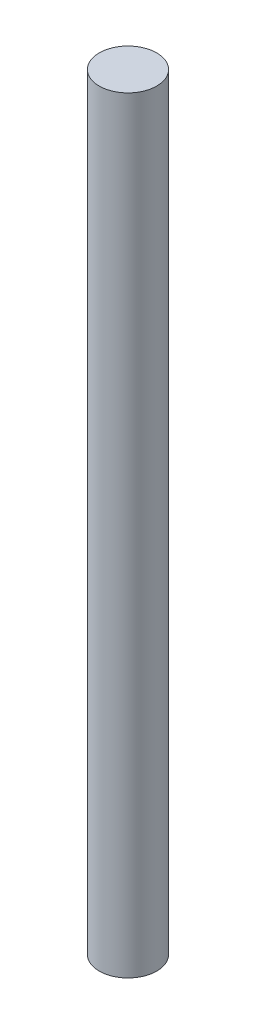
ISO-10303-21;
HEADER;
FILE_DESCRIPTION(('STEP AP214'),'2;1');
FILE_NAME('part.step','',(''),(''),'','','');
FILE_SCHEMA(('AUTOMOTIVE_DESIGN { 1 0 10303 214 1 1 1 1 }'));
ENDSEC;
DATA;
#1=APPLICATION_CONTEXT('core data for automotive mechanical design processes');
#2=APPLICATION_PROTOCOL_DEFINITION('international standard','automotive_design',2000,#1);
#3=PRODUCT_CONTEXT('',#1,'mechanical');
#4=PRODUCT('Part','Part','',(#3));
#5=PRODUCT_RELATED_PRODUCT_CATEGORY('part','',(#4));
#6=PRODUCT_DEFINITION_FORMATION('','',#4);
#7=PRODUCT_DEFINITION_CONTEXT('part definition',#1,'design');
#8=PRODUCT_DEFINITION('design','',#6,#7);
#9=PRODUCT_DEFINITION_SHAPE('','',#8);
#10=(LENGTH_UNIT() NAMED_UNIT(*) SI_UNIT(.MILLI.,.METRE.));
#11=(NAMED_UNIT(*) PLANE_ANGLE_UNIT() SI_UNIT($,.RADIAN.));
#12=(NAMED_UNIT(*) SI_UNIT($,.STERADIAN.) SOLID_ANGLE_UNIT());
#13=UNCERTAINTY_MEASURE_WITH_UNIT(LENGTH_MEASURE(1.E-05),#10,'distance_accuracy_value','');
#14=(GEOMETRIC_REPRESENTATION_CONTEXT(3) GLOBAL_UNCERTAINTY_ASSIGNED_CONTEXT((#13)) GLOBAL_UNIT_ASSIGNED_CONTEXT((#10,
#11,#12)) REPRESENTATION_CONTEXT('',''));
#15=CARTESIAN_POINT('',(0.,0.,0.));
#16=DIRECTION('',(0.,0.,1.));
#17=DIRECTION('',(1.,0.,0.));
#18=AXIS2_PLACEMENT_3D('',#15,#16,#17);
#19=CARTESIAN_POINT('',(0.,100.,0.));
#20=DIRECTION('',(0.,-1.,0.));
#21=DIRECTION('',(0.,0.,-1.));
#22=AXIS2_PLACEMENT_3D('',#19,#20,#21);
#23=CYLINDRICAL_SURFACE('',#22,7.5);
#24=CARTESIAN_POINT('',(0.,100.,0.));
#25=DIRECTION('',(0.,1.,0.));
#26=DIRECTION('',(0.,0.,1.));
#27=AXIS2_PLACEMENT_3D('',#24,#25,#26);
#28=CIRCLE('',#27,7.5);
#29=CARTESIAN_POINT('',(0.,100.,7.5));
#30=VERTEX_POINT('',#29);
#31=EDGE_CURVE('E10',#30,#30,#28,.T.);
#32=ORIENTED_EDGE('',*,*,#31,.F.);
#33=EDGE_LOOP('',(#32));
#34=FACE_BOUND('',#33,.T.);
#35=CARTESIAN_POINT('',(0.,-100.,0.));
#36=DIRECTION('',(0.,1.,0.));
#37=DIRECTION('',(0.,0.,1.));
#38=AXIS2_PLACEMENT_3D('',#35,#36,#37);
#39=CIRCLE('',#38,7.5);
#40=CARTESIAN_POINT('',(0.,-100.,7.5));
#41=VERTEX_POINT('',#40);
#42=EDGE_CURVE('E34',#41,#41,#39,.T.);
#43=ORIENTED_EDGE('',*,*,#42,.T.);
#44=EDGE_LOOP('',(#43));
#45=FACE_BOUND('',#44,.T.);
#46=ADVANCED_FACE('F31',(#34,#45),#23,.T.);
#47=CARTESIAN_POINT('',(0.,100.,0.));
#48=DIRECTION('',(0.,1.,0.));
#49=DIRECTION('',(0.,0.,1.));
#50=AXIS2_PLACEMENT_3D('',#47,#48,#49);
#51=PLANE('',#50);
#52=ORIENTED_EDGE('',*,*,#31,.T.);
#53=EDGE_LOOP('',(#52));
#54=FACE_BOUND('',#53,.T.);
#55=ADVANCED_FACE('F46',(#54),#51,.T.);
#56=CARTESIAN_POINT('',(0.,-100.,0.));
#57=DIRECTION('',(0.,1.,0.));
#58=DIRECTION('',(0.,0.,1.));
#59=AXIS2_PLACEMENT_3D('',#56,#57,#58);
#60=PLANE('',#59);
#61=ORIENTED_EDGE('',*,*,#42,.F.);
#62=EDGE_LOOP('',(#61));
#63=FACE_BOUND('',#62,.T.);
#64=ADVANCED_FACE('F44',(#63),#60,.F.);
#65=CLOSED_SHELL('',(#46,#55,#64));
#66=MANIFOLD_SOLID_BREP('B2',#65);
#67=ADVANCED_BREP_SHAPE_REPRESENTATION('',(#18,#66),#14);
#68=SHAPE_DEFINITION_REPRESENTATION(#9,#67);
ENDSEC;
END-ISO-10303-21;
